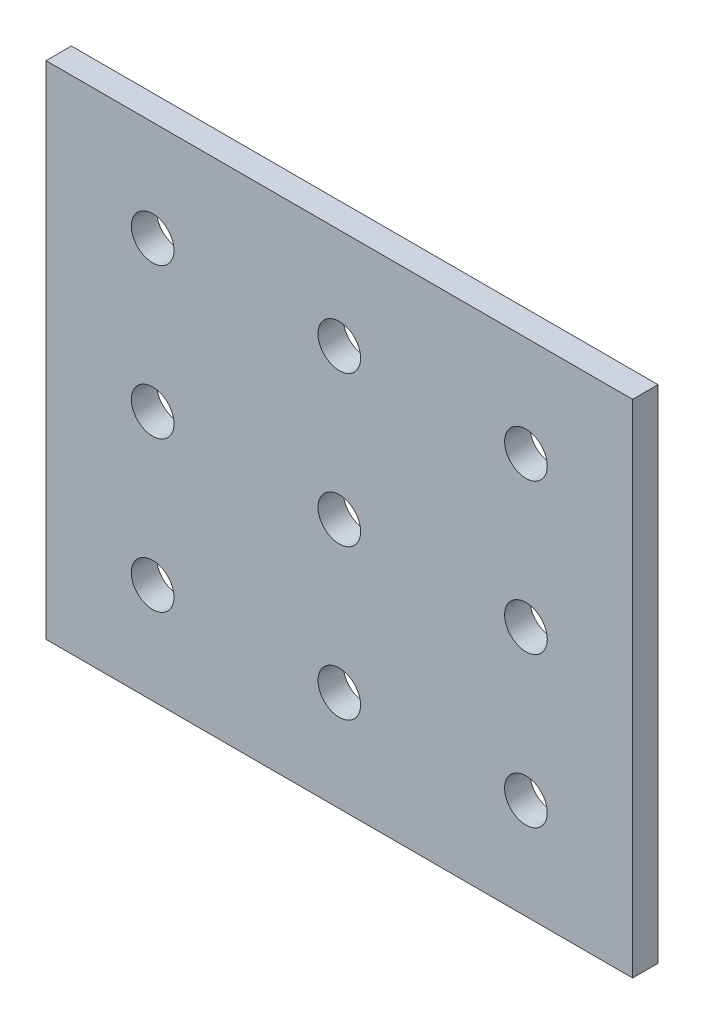
ISO-10303-21;
HEADER;
FILE_DESCRIPTION(('STEP AP214'),'2;1');
FILE_NAME('part.step','',(''),(''),'','','');
FILE_SCHEMA(('AUTOMOTIVE_DESIGN { 1 0 10303 214 1 1 1 1 }'));
ENDSEC;
DATA;
#1=APPLICATION_CONTEXT('core data for automotive mechanical design processes');
#2=APPLICATION_PROTOCOL_DEFINITION('international standard','automotive_design',2000,#1);
#3=PRODUCT_CONTEXT('',#1,'mechanical');
#4=PRODUCT('Part','Part','',(#3));
#5=PRODUCT_RELATED_PRODUCT_CATEGORY('part','',(#4));
#6=PRODUCT_DEFINITION_FORMATION('','',#4);
#7=PRODUCT_DEFINITION_CONTEXT('part definition',#1,'design');
#8=PRODUCT_DEFINITION('design','',#6,#7);
#9=PRODUCT_DEFINITION_SHAPE('','',#8);
#10=(LENGTH_UNIT() NAMED_UNIT(*) SI_UNIT(.MILLI.,.METRE.));
#11=(NAMED_UNIT(*) PLANE_ANGLE_UNIT() SI_UNIT($,.RADIAN.));
#12=(NAMED_UNIT(*) SI_UNIT($,.STERADIAN.) SOLID_ANGLE_UNIT());
#13=UNCERTAINTY_MEASURE_WITH_UNIT(LENGTH_MEASURE(1.E-05),#10,'distance_accuracy_value','');
#14=(GEOMETRIC_REPRESENTATION_CONTEXT(3) GLOBAL_UNCERTAINTY_ASSIGNED_CONTEXT((#13)) GLOBAL_UNIT_ASSIGNED_CONTEXT((#10,
#11,#12)) REPRESENTATION_CONTEXT('',''));
#15=CARTESIAN_POINT('',(0.,0.,0.));
#16=DIRECTION('',(0.,0.,1.));
#17=DIRECTION('',(1.,0.,0.));
#18=AXIS2_PLACEMENT_3D('',#15,#16,#17);
#19=CARTESIAN_POINT('',(0.,0.,0.));
#20=DIRECTION('',(0.,0.,-1.));
#21=DIRECTION('',(-1.,0.,0.));
#22=AXIS2_PLACEMENT_3D('',#19,#20,#21);
#23=PLANE('',#22);
#24=CARTESIAN_POINT('',(80.,38.1,0.));
#25=DIRECTION('',(0.,0.,1.));
#26=DIRECTION('',(1.,0.,0.));
#27=AXIS2_PLACEMENT_3D('',#24,#25,#26);
#28=CIRCLE('',#27,4.00000000000001);
#29=CARTESIAN_POINT('',(84.,38.1,0.));
#30=VERTEX_POINT('',#29);
#31=EDGE_CURVE('E141',#30,#30,#28,.T.);
#32=ORIENTED_EDGE('',*,*,#31,.T.);
#33=EDGE_LOOP('',(#32));
#34=FACE_BOUND('',#33,.T.);
#35=CARTESIAN_POINT('',(45.,66.25,0.));
#36=DIRECTION('',(0.,0.,1.));
#37=DIRECTION('',(1.,0.,0.));
#38=AXIS2_PLACEMENT_3D('',#35,#36,#37);
#39=CIRCLE('',#38,4.00000000000001);
#40=CARTESIAN_POINT('',(49.,66.25,0.));
#41=VERTEX_POINT('',#40);
#42=EDGE_CURVE('E147',#41,#41,#39,.T.);
#43=ORIENTED_EDGE('',*,*,#42,.T.);
#44=EDGE_LOOP('',(#43));
#45=FACE_BOUND('',#44,.T.);
#46=CARTESIAN_POINT('',(10.,66.25,0.));
#47=DIRECTION('',(0.,0.,1.));
#48=DIRECTION('',(1.,0.,0.));
#49=AXIS2_PLACEMENT_3D('',#46,#47,#48);
#50=CIRCLE('',#49,4.);
#51=CARTESIAN_POINT('',(14.,66.25,0.));
#52=VERTEX_POINT('',#51);
#53=EDGE_CURVE('E153',#52,#52,#50,.T.);
#54=ORIENTED_EDGE('',*,*,#53,.T.);
#55=EDGE_LOOP('',(#54));
#56=FACE_BOUND('',#55,.T.);
#57=CARTESIAN_POINT('',(10.,9.95,0.));
#58=DIRECTION('',(0.,0.,1.));
#59=DIRECTION('',(1.,0.,0.));
#60=AXIS2_PLACEMENT_3D('',#57,#58,#59);
#61=CIRCLE('',#60,4.);
#62=CARTESIAN_POINT('',(14.,9.95,0.));
#63=VERTEX_POINT('',#62);
#64=EDGE_CURVE('E42',#63,#63,#61,.T.);
#65=ORIENTED_EDGE('',*,*,#64,.T.);
#66=EDGE_LOOP('',(#65));
#67=FACE_BOUND('',#66,.T.);
#68=DIRECTION('',(-1.,0.,0.));
#69=VECTOR('',#68,1.);
#70=CARTESIAN_POINT('',(95.,85.09,0.));
#71=LINE('',#70,#69);
#72=CARTESIAN_POINT('',(100.,85.09,0.));
#73=VERTEX_POINT('',#72);
#74=CARTESIAN_POINT('',(-10.,85.09,0.));
#75=VERTEX_POINT('',#74);
#76=EDGE_CURVE('E107',#73,#75,#71,.T.);
#77=ORIENTED_EDGE('',*,*,#76,.F.);
#78=DIRECTION('',(0.,1.,0.));
#79=VECTOR('',#78,1.);
#80=CARTESIAN_POINT('',(100.,-8.89,0.));
#81=LINE('',#80,#79);
#82=CARTESIAN_POINT('',(100.,-8.89,0.));
#83=VERTEX_POINT('',#82);
#84=EDGE_CURVE('E81',#83,#73,#81,.T.);
#85=ORIENTED_EDGE('',*,*,#84,.F.);
#86=DIRECTION('',(1.,0.,0.));
#87=VECTOR('',#86,1.);
#88=CARTESIAN_POINT('',(95.,-8.89,0.));
#89=LINE('',#88,#87);
#90=CARTESIAN_POINT('',(-10.,-8.89,0.));
#91=VERTEX_POINT('',#90);
#92=EDGE_CURVE('E49',#91,#83,#89,.T.);
#93=ORIENTED_EDGE('',*,*,#92,.F.);
#94=DIRECTION('',(0.,-1.,0.));
#95=VECTOR('',#94,1.);
#96=CARTESIAN_POINT('',(-10.,-8.89,0.));
#97=LINE('',#96,#95);
#98=EDGE_CURVE('E79',#75,#91,#97,.T.);
#99=ORIENTED_EDGE('',*,*,#98,.F.);
#100=EDGE_LOOP('',(#77,#85,#93,#99));
#101=FACE_BOUND('',#100,.T.);
#102=CARTESIAN_POINT('',(45.,38.1,0.));
#103=DIRECTION('',(0.,0.,1.));
#104=DIRECTION('',(1.,0.,0.));
#105=AXIS2_PLACEMENT_3D('',#102,#103,#104);
#106=CIRCLE('',#105,4.00000000000001);
#107=CARTESIAN_POINT('',(49.,38.1,0.));
#108=VERTEX_POINT('',#107);
#109=EDGE_CURVE('E11',#108,#108,#106,.T.);
#110=ORIENTED_EDGE('',*,*,#109,.T.);
#111=EDGE_LOOP('',(#110));
#112=FACE_BOUND('',#111,.T.);
#113=CARTESIAN_POINT('',(80.,66.25,0.));
#114=DIRECTION('',(0.,0.,1.));
#115=DIRECTION('',(1.,0.,0.));
#116=AXIS2_PLACEMENT_3D('',#113,#114,#115);
#117=CIRCLE('',#116,4.00000000000003);
#118=CARTESIAN_POINT('',(84.,66.25,0.));
#119=VERTEX_POINT('',#118);
#120=EDGE_CURVE('E156',#119,#119,#117,.T.);
#121=ORIENTED_EDGE('',*,*,#120,.T.);
#122=EDGE_LOOP('',(#121));
#123=FACE_BOUND('',#122,.T.);
#124=CARTESIAN_POINT('',(80.,9.95,0.));
#125=DIRECTION('',(0.,0.,1.));
#126=DIRECTION('',(1.,0.,0.));
#127=AXIS2_PLACEMENT_3D('',#124,#125,#126);
#128=CIRCLE('',#127,4.00000000000001);
#129=CARTESIAN_POINT('',(84.,9.95,0.));
#130=VERTEX_POINT('',#129);
#131=EDGE_CURVE('E150',#130,#130,#128,.T.);
#132=ORIENTED_EDGE('',*,*,#131,.T.);
#133=EDGE_LOOP('',(#132));
#134=FACE_BOUND('',#133,.T.);
#135=CARTESIAN_POINT('',(10.,38.1,0.));
#136=DIRECTION('',(0.,0.,1.));
#137=DIRECTION('',(1.,0.,0.));
#138=AXIS2_PLACEMENT_3D('',#135,#136,#137);
#139=CIRCLE('',#138,4.);
#140=CARTESIAN_POINT('',(14.,38.1,0.));
#141=VERTEX_POINT('',#140);
#142=EDGE_CURVE('E144',#141,#141,#139,.T.);
#143=ORIENTED_EDGE('',*,*,#142,.T.);
#144=EDGE_LOOP('',(#143));
#145=FACE_BOUND('',#144,.T.);
#146=CARTESIAN_POINT('',(45.,9.95,0.));
#147=DIRECTION('',(0.,0.,1.));
#148=DIRECTION('',(1.,0.,0.));
#149=AXIS2_PLACEMENT_3D('',#146,#147,#148);
#150=CIRCLE('',#149,4.00000000000001);
#151=CARTESIAN_POINT('',(49.,9.95,0.));
#152=VERTEX_POINT('',#151);
#153=EDGE_CURVE('E138',#152,#152,#150,.T.);
#154=ORIENTED_EDGE('',*,*,#153,.T.);
#155=EDGE_LOOP('',(#154));
#156=FACE_BOUND('',#155,.T.);
#157=ADVANCED_FACE('F35',(#34,#45,#56,#67,#101,#112,#123,#134,#145,#156),#23,.T.);
#158=CARTESIAN_POINT('',(45.,38.1,0.47625));
#159=DIRECTION('',(0.,0.,-1.));
#160=DIRECTION('',(-1.,0.,0.));
#161=AXIS2_PLACEMENT_3D('',#158,#159,#160);
#162=CYLINDRICAL_SURFACE('',#161,4.00000000000001);
#163=ORIENTED_EDGE('',*,*,#109,.F.);
#164=EDGE_LOOP('',(#163));
#165=FACE_BOUND('',#164,.T.);
#166=CARTESIAN_POINT('',(45.,38.1,4.7625));
#167=DIRECTION('',(0.,0.,1.));
#168=DIRECTION('',(1.,0.,0.));
#169=AXIS2_PLACEMENT_3D('',#166,#167,#168);
#170=CIRCLE('',#169,4.00000000000001);
#171=CARTESIAN_POINT('',(49.,38.1,4.7625));
#172=VERTEX_POINT('',#171);
#173=EDGE_CURVE('E135',#172,#172,#170,.T.);
#174=ORIENTED_EDGE('',*,*,#173,.T.);
#175=EDGE_LOOP('',(#174));
#176=FACE_BOUND('',#175,.T.);
#177=ADVANCED_FACE('F166',(#165,#176),#162,.F.);
#178=CARTESIAN_POINT('',(10.,9.95,0.47625));
#179=DIRECTION('',(0.,0.,-1.));
#180=DIRECTION('',(-1.,0.,0.));
#181=AXIS2_PLACEMENT_3D('',#178,#179,#180);
#182=CYLINDRICAL_SURFACE('',#181,4.);
#183=ORIENTED_EDGE('',*,*,#64,.F.);
#184=EDGE_LOOP('',(#183));
#185=FACE_BOUND('',#184,.T.);
#186=CARTESIAN_POINT('',(10.,9.95,4.7625));
#187=DIRECTION('',(0.,0.,1.));
#188=DIRECTION('',(1.,0.,0.));
#189=AXIS2_PLACEMENT_3D('',#186,#187,#188);
#190=CIRCLE('',#189,4.);
#191=CARTESIAN_POINT('',(14.,9.95,4.7625));
#192=VERTEX_POINT('',#191);
#193=EDGE_CURVE('E132',#192,#192,#190,.T.);
#194=ORIENTED_EDGE('',*,*,#193,.T.);
#195=EDGE_LOOP('',(#194));
#196=FACE_BOUND('',#195,.T.);
#197=ADVANCED_FACE('F162',(#185,#196),#182,.F.);
#198=CARTESIAN_POINT('',(80.,66.25,0.47625));
#199=DIRECTION('',(0.,0.,-1.));
#200=DIRECTION('',(-1.,0.,0.));
#201=AXIS2_PLACEMENT_3D('',#198,#199,#200);
#202=CYLINDRICAL_SURFACE('',#201,4.00000000000003);
#203=ORIENTED_EDGE('',*,*,#120,.F.);
#204=EDGE_LOOP('',(#203));
#205=FACE_BOUND('',#204,.T.);
#206=CARTESIAN_POINT('',(80.,66.25,4.7625));
#207=DIRECTION('',(0.,0.,1.));
#208=DIRECTION('',(1.,0.,0.));
#209=AXIS2_PLACEMENT_3D('',#206,#207,#208);
#210=CIRCLE('',#209,4.00000000000003);
#211=CARTESIAN_POINT('',(84.,66.25,4.7625));
#212=VERTEX_POINT('',#211);
#213=EDGE_CURVE('E129',#212,#212,#210,.T.);
#214=ORIENTED_EDGE('',*,*,#213,.T.);
#215=EDGE_LOOP('',(#214));
#216=FACE_BOUND('',#215,.T.);
#217=ADVANCED_FACE('F165',(#205,#216),#202,.F.);
#218=CARTESIAN_POINT('',(10.,66.25,0.47625));
#219=DIRECTION('',(0.,0.,-1.));
#220=DIRECTION('',(-1.,0.,0.));
#221=AXIS2_PLACEMENT_3D('',#218,#219,#220);
#222=CYLINDRICAL_SURFACE('',#221,4.);
#223=ORIENTED_EDGE('',*,*,#53,.F.);
#224=EDGE_LOOP('',(#223));
#225=FACE_BOUND('',#224,.T.);
#226=CARTESIAN_POINT('',(10.,66.25,4.7625));
#227=DIRECTION('',(0.,0.,1.));
#228=DIRECTION('',(1.,0.,0.));
#229=AXIS2_PLACEMENT_3D('',#226,#227,#228);
#230=CIRCLE('',#229,4.);
#231=CARTESIAN_POINT('',(14.,66.25,4.7625));
#232=VERTEX_POINT('',#231);
#233=EDGE_CURVE('E126',#232,#232,#230,.T.);
#234=ORIENTED_EDGE('',*,*,#233,.T.);
#235=EDGE_LOOP('',(#234));
#236=FACE_BOUND('',#235,.T.);
#237=ADVANCED_FACE('F212',(#225,#236),#222,.F.);
#238=CARTESIAN_POINT('',(80.,9.95,0.47625));
#239=DIRECTION('',(0.,0.,-1.));
#240=DIRECTION('',(-1.,0.,0.));
#241=AXIS2_PLACEMENT_3D('',#238,#239,#240);
#242=CYLINDRICAL_SURFACE('',#241,4.00000000000001);
#243=ORIENTED_EDGE('',*,*,#131,.F.);
#244=EDGE_LOOP('',(#243));
#245=FACE_BOUND('',#244,.T.);
#246=CARTESIAN_POINT('',(80.,9.95,4.7625));
#247=DIRECTION('',(0.,0.,1.));
#248=DIRECTION('',(1.,0.,0.));
#249=AXIS2_PLACEMENT_3D('',#246,#247,#248);
#250=CIRCLE('',#249,4.00000000000001);
#251=CARTESIAN_POINT('',(84.,9.95,4.7625));
#252=VERTEX_POINT('',#251);
#253=EDGE_CURVE('E123',#252,#252,#250,.T.);
#254=ORIENTED_EDGE('',*,*,#253,.T.);
#255=EDGE_LOOP('',(#254));
#256=FACE_BOUND('',#255,.T.);
#257=ADVANCED_FACE('F215',(#245,#256),#242,.F.);
#258=CARTESIAN_POINT('',(45.,66.25,0.47625));
#259=DIRECTION('',(0.,0.,-1.));
#260=DIRECTION('',(-1.,0.,0.));
#261=AXIS2_PLACEMENT_3D('',#258,#259,#260);
#262=CYLINDRICAL_SURFACE('',#261,4.00000000000001);
#263=ORIENTED_EDGE('',*,*,#42,.F.);
#264=EDGE_LOOP('',(#263));
#265=FACE_BOUND('',#264,.T.);
#266=CARTESIAN_POINT('',(45.,66.25,4.7625));
#267=DIRECTION('',(0.,0.,1.));
#268=DIRECTION('',(1.,0.,0.));
#269=AXIS2_PLACEMENT_3D('',#266,#267,#268);
#270=CIRCLE('',#269,4.00000000000001);
#271=CARTESIAN_POINT('',(49.,66.25,4.7625));
#272=VERTEX_POINT('',#271);
#273=EDGE_CURVE('E120',#272,#272,#270,.T.);
#274=ORIENTED_EDGE('',*,*,#273,.T.);
#275=EDGE_LOOP('',(#274));
#276=FACE_BOUND('',#275,.T.);
#277=ADVANCED_FACE('F221',(#265,#276),#262,.F.);
#278=CARTESIAN_POINT('',(10.,38.1,0.47625));
#279=DIRECTION('',(0.,0.,-1.));
#280=DIRECTION('',(-1.,0.,0.));
#281=AXIS2_PLACEMENT_3D('',#278,#279,#280);
#282=CYLINDRICAL_SURFACE('',#281,4.);
#283=ORIENTED_EDGE('',*,*,#142,.F.);
#284=EDGE_LOOP('',(#283));
#285=FACE_BOUND('',#284,.T.);
#286=CARTESIAN_POINT('',(10.,38.1,4.7625));
#287=DIRECTION('',(0.,0.,1.));
#288=DIRECTION('',(1.,0.,0.));
#289=AXIS2_PLACEMENT_3D('',#286,#287,#288);
#290=CIRCLE('',#289,4.);
#291=CARTESIAN_POINT('',(14.,38.1,4.7625));
#292=VERTEX_POINT('',#291);
#293=EDGE_CURVE('E117',#292,#292,#290,.T.);
#294=ORIENTED_EDGE('',*,*,#293,.T.);
#295=EDGE_LOOP('',(#294));
#296=FACE_BOUND('',#295,.T.);
#297=ADVANCED_FACE('F197',(#285,#296),#282,.F.);
#298=CARTESIAN_POINT('',(80.,38.1,0.47625));
#299=DIRECTION('',(0.,0.,-1.));
#300=DIRECTION('',(-1.,0.,0.));
#301=AXIS2_PLACEMENT_3D('',#298,#299,#300);
#302=CYLINDRICAL_SURFACE('',#301,4.00000000000001);
#303=ORIENTED_EDGE('',*,*,#31,.F.);
#304=EDGE_LOOP('',(#303));
#305=FACE_BOUND('',#304,.T.);
#306=CARTESIAN_POINT('',(80.,38.1,4.7625));
#307=DIRECTION('',(0.,0.,1.));
#308=DIRECTION('',(1.,0.,0.));
#309=AXIS2_PLACEMENT_3D('',#306,#307,#308);
#310=CIRCLE('',#309,4.00000000000001);
#311=CARTESIAN_POINT('',(84.,38.1,4.7625));
#312=VERTEX_POINT('',#311);
#313=EDGE_CURVE('E114',#312,#312,#310,.T.);
#314=ORIENTED_EDGE('',*,*,#313,.T.);
#315=EDGE_LOOP('',(#314));
#316=FACE_BOUND('',#315,.T.);
#317=ADVANCED_FACE('F190',(#305,#316),#302,.F.);
#318=CARTESIAN_POINT('',(45.,9.95,0.47625));
#319=DIRECTION('',(0.,0.,-1.));
#320=DIRECTION('',(-1.,0.,0.));
#321=AXIS2_PLACEMENT_3D('',#318,#319,#320);
#322=CYLINDRICAL_SURFACE('',#321,4.00000000000001);
#323=ORIENTED_EDGE('',*,*,#153,.F.);
#324=EDGE_LOOP('',(#323));
#325=FACE_BOUND('',#324,.T.);
#326=CARTESIAN_POINT('',(45.,9.95,4.7625));
#327=DIRECTION('',(0.,0.,1.));
#328=DIRECTION('',(1.,0.,0.));
#329=AXIS2_PLACEMENT_3D('',#326,#327,#328);
#330=CIRCLE('',#329,4.00000000000001);
#331=CARTESIAN_POINT('',(49.,9.95,4.7625));
#332=VERTEX_POINT('',#331);
#333=EDGE_CURVE('E82',#332,#332,#330,.T.);
#334=ORIENTED_EDGE('',*,*,#333,.T.);
#335=EDGE_LOOP('',(#334));
#336=FACE_BOUND('',#335,.T.);
#337=ADVANCED_FACE('F173',(#325,#336),#322,.F.);
#338=CARTESIAN_POINT('',(0.,0.,4.7625));
#339=DIRECTION('',(0.,0.,-1.));
#340=DIRECTION('',(-1.,0.,0.));
#341=AXIS2_PLACEMENT_3D('',#338,#339,#340);
#342=PLANE('',#341);
#343=DIRECTION('',(-1.,0.,0.));
#344=VECTOR('',#343,1.);
#345=CARTESIAN_POINT('',(95.,-8.89,4.7625));
#346=LINE('',#345,#344);
#347=CARTESIAN_POINT('',(100.,-8.89,4.7625));
#348=VERTEX_POINT('',#347);
#349=CARTESIAN_POINT('',(-10.,-8.89,4.7625));
#350=VERTEX_POINT('',#349);
#351=EDGE_CURVE('E57',#348,#350,#346,.T.);
#352=ORIENTED_EDGE('',*,*,#351,.F.);
#353=DIRECTION('',(0.,-1.,0.));
#354=VECTOR('',#353,1.);
#355=CARTESIAN_POINT('',(100.,-8.89,4.7625));
#356=LINE('',#355,#354);
#357=CARTESIAN_POINT('',(100.,85.09,4.7625));
#358=VERTEX_POINT('',#357);
#359=EDGE_CURVE('E103',#358,#348,#356,.T.);
#360=ORIENTED_EDGE('',*,*,#359,.F.);
#361=DIRECTION('',(1.,0.,0.));
#362=VECTOR('',#361,1.);
#363=CARTESIAN_POINT('',(95.,85.09,4.7625));
#364=LINE('',#363,#362);
#365=CARTESIAN_POINT('',(-10.,85.09,4.7625));
#366=VERTEX_POINT('',#365);
#367=EDGE_CURVE('E109',#366,#358,#364,.T.);
#368=ORIENTED_EDGE('',*,*,#367,.F.);
#369=DIRECTION('',(0.,1.,0.));
#370=VECTOR('',#369,1.);
#371=CARTESIAN_POINT('',(-10.,-8.89,4.7625));
#372=LINE('',#371,#370);
#373=EDGE_CURVE('E89',#350,#366,#372,.T.);
#374=ORIENTED_EDGE('',*,*,#373,.F.);
#375=EDGE_LOOP('',(#352,#360,#368,#374));
#376=FACE_BOUND('',#375,.T.);
#377=ORIENTED_EDGE('',*,*,#173,.F.);
#378=EDGE_LOOP('',(#377));
#379=FACE_BOUND('',#378,.T.);
#380=ORIENTED_EDGE('',*,*,#193,.F.);
#381=EDGE_LOOP('',(#380));
#382=FACE_BOUND('',#381,.T.);
#383=ORIENTED_EDGE('',*,*,#213,.F.);
#384=EDGE_LOOP('',(#383));
#385=FACE_BOUND('',#384,.T.);
#386=ORIENTED_EDGE('',*,*,#233,.F.);
#387=EDGE_LOOP('',(#386));
#388=FACE_BOUND('',#387,.T.);
#389=ORIENTED_EDGE('',*,*,#253,.F.);
#390=EDGE_LOOP('',(#389));
#391=FACE_BOUND('',#390,.T.);
#392=ORIENTED_EDGE('',*,*,#273,.F.);
#393=EDGE_LOOP('',(#392));
#394=FACE_BOUND('',#393,.T.);
#395=ORIENTED_EDGE('',*,*,#293,.F.);
#396=EDGE_LOOP('',(#395));
#397=FACE_BOUND('',#396,.T.);
#398=ORIENTED_EDGE('',*,*,#313,.F.);
#399=EDGE_LOOP('',(#398));
#400=FACE_BOUND('',#399,.T.);
#401=ORIENTED_EDGE('',*,*,#333,.F.);
#402=EDGE_LOOP('',(#401));
#403=FACE_BOUND('',#402,.T.);
#404=ADVANCED_FACE('F170',(#376,#379,#382,#385,#388,#391,#394,#397,#400,#403),#342,.F.);
#405=CARTESIAN_POINT('',(0.,-8.89,0.));
#406=DIRECTION('',(0.,-1.,0.));
#407=DIRECTION('',(0.,0.,-1.));
#408=AXIS2_PLACEMENT_3D('',#405,#406,#407);
#409=PLANE('',#408);
#410=ORIENTED_EDGE('',*,*,#92,.T.);
#411=DIRECTION('',(0.,0.,-1.));
#412=VECTOR('',#411,1.);
#413=CARTESIAN_POINT('',(100.,-8.89,0.));
#414=LINE('',#413,#412);
#415=EDGE_CURVE('E105',#348,#83,#414,.T.);
#416=ORIENTED_EDGE('',*,*,#415,.F.);
#417=ORIENTED_EDGE('',*,*,#351,.T.);
#418=DIRECTION('',(0.,0.,1.));
#419=VECTOR('',#418,1.);
#420=CARTESIAN_POINT('',(-10.,-8.89,0.));
#421=LINE('',#420,#419);
#422=EDGE_CURVE('E85',#91,#350,#421,.T.);
#423=ORIENTED_EDGE('',*,*,#422,.F.);
#424=EDGE_LOOP('',(#410,#416,#417,#423));
#425=FACE_BOUND('',#424,.T.);
#426=ADVANCED_FACE('F86',(#425),#409,.T.);
#427=CARTESIAN_POINT('',(0.,85.09,0.));
#428=DIRECTION('',(0.,-1.,0.));
#429=DIRECTION('',(0.,0.,-1.));
#430=AXIS2_PLACEMENT_3D('',#427,#428,#429);
#431=PLANE('',#430);
#432=ORIENTED_EDGE('',*,*,#367,.T.);
#433=DIRECTION('',(0.,0.,1.));
#434=VECTOR('',#433,1.);
#435=CARTESIAN_POINT('',(100.,85.09,0.));
#436=LINE('',#435,#434);
#437=EDGE_CURVE('E100',#73,#358,#436,.T.);
#438=ORIENTED_EDGE('',*,*,#437,.F.);
#439=ORIENTED_EDGE('',*,*,#76,.T.);
#440=DIRECTION('',(0.,0.,-1.));
#441=VECTOR('',#440,1.);
#442=CARTESIAN_POINT('',(-10.,85.09,0.));
#443=LINE('',#442,#441);
#444=EDGE_CURVE('E94',#366,#75,#443,.T.);
#445=ORIENTED_EDGE('',*,*,#444,.F.);
#446=EDGE_LOOP('',(#432,#438,#439,#445));
#447=FACE_BOUND('',#446,.T.);
#448=ADVANCED_FACE('F260',(#447),#431,.F.);
#449=CARTESIAN_POINT('',(100.,0.,0.));
#450=DIRECTION('',(1.,0.,0.));
#451=DIRECTION('',(0.,0.,-1.));
#452=AXIS2_PLACEMENT_3D('',#449,#450,#451);
#453=PLANE('',#452);
#454=ORIENTED_EDGE('',*,*,#84,.T.);
#455=ORIENTED_EDGE('',*,*,#437,.T.);
#456=ORIENTED_EDGE('',*,*,#359,.T.);
#457=ORIENTED_EDGE('',*,*,#415,.T.);
#458=EDGE_LOOP('',(#454,#455,#456,#457));
#459=FACE_BOUND('',#458,.T.);
#460=ADVANCED_FACE('F256',(#459),#453,.T.);
#461=CARTESIAN_POINT('',(-10.,0.,0.));
#462=DIRECTION('',(1.,0.,0.));
#463=DIRECTION('',(0.,0.,-1.));
#464=AXIS2_PLACEMENT_3D('',#461,#462,#463);
#465=PLANE('',#464);
#466=ORIENTED_EDGE('',*,*,#98,.T.);
#467=ORIENTED_EDGE('',*,*,#422,.T.);
#468=ORIENTED_EDGE('',*,*,#373,.T.);
#469=ORIENTED_EDGE('',*,*,#444,.T.);
#470=EDGE_LOOP('',(#466,#467,#468,#469));
#471=FACE_BOUND('',#470,.T.);
#472=ADVANCED_FACE('F92',(#471),#465,.F.);
#473=CLOSED_SHELL('',(#157,#177,#197,#217,#237,#257,#277,#297,#317,#337,#404,#426,#448,#460,#472));
#474=MANIFOLD_SOLID_BREP('B2',#473);
#475=ADVANCED_BREP_SHAPE_REPRESENTATION('',(#18,#474),#14);
#476=SHAPE_DEFINITION_REPRESENTATION(#9,#475);
ENDSEC;
END-ISO-10303-21;
